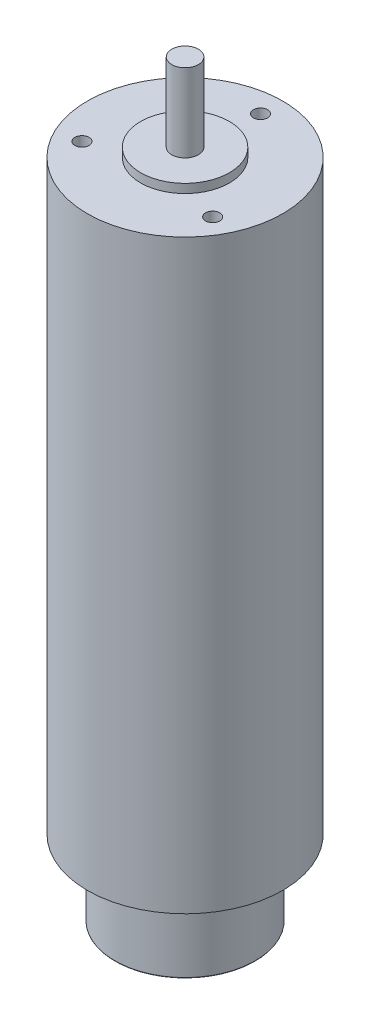
ISO-10303-21;
HEADER;
FILE_DESCRIPTION(('STEP AP214'),'2;1');
FILE_NAME('part.step','',(''),(''),'','','');
FILE_SCHEMA(('AUTOMOTIVE_DESIGN { 1 0 10303 214 1 1 1 1 }'));
ENDSEC;
DATA;
#1=APPLICATION_CONTEXT('core data for automotive mechanical design processes');
#2=APPLICATION_PROTOCOL_DEFINITION('international standard','automotive_design',2000,#1);
#3=PRODUCT_CONTEXT('',#1,'mechanical');
#4=PRODUCT('Part','Part','',(#3));
#5=PRODUCT_RELATED_PRODUCT_CATEGORY('part','',(#4));
#6=PRODUCT_DEFINITION_FORMATION('','',#4);
#7=PRODUCT_DEFINITION_CONTEXT('part definition',#1,'design');
#8=PRODUCT_DEFINITION('design','',#6,#7);
#9=PRODUCT_DEFINITION_SHAPE('','',#8);
#10=(LENGTH_UNIT() NAMED_UNIT(*) SI_UNIT(.MILLI.,.METRE.));
#11=(NAMED_UNIT(*) PLANE_ANGLE_UNIT() SI_UNIT($,.RADIAN.));
#12=(NAMED_UNIT(*) SI_UNIT($,.STERADIAN.) SOLID_ANGLE_UNIT());
#13=UNCERTAINTY_MEASURE_WITH_UNIT(LENGTH_MEASURE(1.E-05),#10,'distance_accuracy_value','');
#14=(GEOMETRIC_REPRESENTATION_CONTEXT(3) GLOBAL_UNCERTAINTY_ASSIGNED_CONTEXT((#13)) GLOBAL_UNIT_ASSIGNED_CONTEXT((#10,
#11,#12)) REPRESENTATION_CONTEXT('',''));
#15=CARTESIAN_POINT('',(0.,0.,0.));
#16=DIRECTION('',(0.,0.,1.));
#17=DIRECTION('',(1.,0.,0.));
#18=AXIS2_PLACEMENT_3D('',#15,#16,#17);
#19=CARTESIAN_POINT('',(0.,-8.5,0.));
#20=DIRECTION('',(0.,1.,0.));
#21=DIRECTION('',(0.,0.,1.));
#22=AXIS2_PLACEMENT_3D('',#19,#20,#21);
#23=CYLINDRICAL_SURFACE('',#22,7.9);
#24=CARTESIAN_POINT('',(0.,-8.4,0.));
#25=DIRECTION('',(0.,-1.,0.));
#26=DIRECTION('',(0.,0.,-1.));
#27=AXIS2_PLACEMENT_3D('',#24,#25,#26);
#28=CIRCLE('',#27,7.9);
#29=CARTESIAN_POINT('',(0.,-8.4,-7.9));
#30=VERTEX_POINT('',#29);
#31=EDGE_CURVE('E11',#30,#30,#28,.F.);
#32=ORIENTED_EDGE('',*,*,#31,.T.);
#33=EDGE_LOOP('',(#32));
#34=FACE_BOUND('',#33,.T.);
#35=CARTESIAN_POINT('',(0.,0.,0.));
#36=DIRECTION('',(0.,-1.,0.));
#37=DIRECTION('',(0.,0.,-1.));
#38=AXIS2_PLACEMENT_3D('',#35,#36,#37);
#39=CIRCLE('',#38,7.9);
#40=CARTESIAN_POINT('',(0.,0.,-7.9));
#41=VERTEX_POINT('',#40);
#42=EDGE_CURVE('E57',#41,#41,#39,.T.);
#43=ORIENTED_EDGE('',*,*,#42,.T.);
#44=EDGE_LOOP('',(#43));
#45=FACE_BOUND('',#44,.T.);
#46=ADVANCED_FACE('F46',(#34,#45),#23,.T.);
#47=CARTESIAN_POINT('',(0.,-8.5,0.));
#48=DIRECTION('',(0.,-1.,0.));
#49=DIRECTION('',(0.,0.,-1.));
#50=AXIS2_PLACEMENT_3D('',#47,#48,#49);
#51=PLANE('',#50);
#52=CARTESIAN_POINT('',(0.,-8.5,0.));
#53=DIRECTION('',(0.,-1.,0.));
#54=DIRECTION('',(0.,0.,-1.));
#55=AXIS2_PLACEMENT_3D('',#52,#53,#54);
#56=CIRCLE('',#55,7.8);
#57=CARTESIAN_POINT('',(0.,-8.5,-7.8));
#58=VERTEX_POINT('',#57);
#59=EDGE_CURVE('E53',#58,#58,#56,.T.);
#60=ORIENTED_EDGE('',*,*,#59,.T.);
#61=EDGE_LOOP('',(#60));
#62=FACE_BOUND('',#61,.T.);
#63=ADVANCED_FACE('F67',(#62),#51,.T.);
#64=CARTESIAN_POINT('',(0.,0.,0.));
#65=DIRECTION('',(0.,-1.,0.));
#66=DIRECTION('',(0.,0.,-1.));
#67=AXIS2_PLACEMENT_3D('',#64,#65,#66);
#68=PLANE('',#67);
#69=ORIENTED_EDGE('',*,*,#42,.F.);
#70=EDGE_LOOP('',(#69));
#71=FACE_BOUND('',#70,.T.);
#72=ADVANCED_FACE('F65',(#71),#68,.F.);
#73=CARTESIAN_POINT('',(0.,-8.4,0.));
#74=DIRECTION('',(0.,-1.,0.));
#75=DIRECTION('',(0.,0.,-1.));
#76=AXIS2_PLACEMENT_3D('',#73,#74,#75);
#77=TOROIDAL_SURFACE('',#76,7.8,0.1);
#78=ORIENTED_EDGE('',*,*,#31,.F.);
#79=EDGE_LOOP('',(#78));
#80=FACE_BOUND('',#79,.T.);
#81=ORIENTED_EDGE('',*,*,#59,.F.);
#82=EDGE_LOOP('',(#81));
#83=FACE_BOUND('',#82,.T.);
#84=ADVANCED_FACE('F48',(#80,#83),#77,.T.);
#85=CLOSED_SHELL('',(#46,#63,#72,#84));
#86=MANIFOLD_SOLID_BREP('B2',#85);
#87=CARTESIAN_POINT('',(0.,75.8,0.));
#88=DIRECTION('',(0.,-1.,0.));
#89=DIRECTION('',(0.,0.,-1.));
#90=AXIS2_PLACEMENT_3D('',#87,#88,#89);
#91=CYLINDRICAL_SURFACE('',#90,1.5);
#92=CARTESIAN_POINT('',(0.,75.8,0.));
#93=DIRECTION('',(0.,1.,0.));
#94=DIRECTION('',(0.,0.,1.));
#95=AXIS2_PLACEMENT_3D('',#92,#93,#94);
#96=CIRCLE('',#95,1.5);
#97=CARTESIAN_POINT('',(0.,75.8,1.5));
#98=VERTEX_POINT('',#97);
#99=EDGE_CURVE('E45',#98,#98,#96,.T.);
#100=ORIENTED_EDGE('',*,*,#99,.F.);
#101=EDGE_LOOP('',(#100));
#102=FACE_BOUND('',#101,.T.);
#103=CARTESIAN_POINT('',(0.,67.,0.));
#104=DIRECTION('',(0.,1.,0.));
#105=DIRECTION('',(0.,0.,1.));
#106=AXIS2_PLACEMENT_3D('',#103,#104,#105);
#107=CIRCLE('',#106,1.5);
#108=CARTESIAN_POINT('',(0.,67.,1.5));
#109=VERTEX_POINT('',#108);
#110=EDGE_CURVE('E113',#109,#109,#107,.T.);
#111=ORIENTED_EDGE('',*,*,#110,.T.);
#112=EDGE_LOOP('',(#111));
#113=FACE_BOUND('',#112,.T.);
#114=ADVANCED_FACE('F110',(#102,#113),#91,.T.);
#115=CARTESIAN_POINT('',(0.,75.8,0.));
#116=DIRECTION('',(0.,1.,0.));
#117=DIRECTION('',(0.,0.,1.));
#118=AXIS2_PLACEMENT_3D('',#115,#116,#117);
#119=PLANE('',#118);
#120=ORIENTED_EDGE('',*,*,#99,.T.);
#121=EDGE_LOOP('',(#120));
#122=FACE_BOUND('',#121,.T.);
#123=ADVANCED_FACE('F125',(#122),#119,.T.);
#124=CARTESIAN_POINT('',(0.,67.,0.));
#125=DIRECTION('',(0.,1.,0.));
#126=DIRECTION('',(0.,0.,1.));
#127=AXIS2_PLACEMENT_3D('',#124,#125,#126);
#128=PLANE('',#127);
#129=ORIENTED_EDGE('',*,*,#110,.F.);
#130=EDGE_LOOP('',(#129));
#131=FACE_BOUND('',#130,.T.);
#132=ADVANCED_FACE('F123',(#131),#128,.F.);
#133=CLOSED_SHELL('',(#114,#123,#132));
#134=MANIFOLD_SOLID_BREP('B6',#133);
#135=CARTESIAN_POINT('',(0.,67.,0.));
#136=DIRECTION('',(0.,-1.,0.));
#137=DIRECTION('',(0.,0.,-1.));
#138=AXIS2_PLACEMENT_3D('',#135,#136,#137);
#139=CYLINDRICAL_SURFACE('',#138,5.);
#140=CARTESIAN_POINT('',(0.,67.,0.));
#141=DIRECTION('',(0.,1.,0.));
#142=DIRECTION('',(0.,0.,1.));
#143=AXIS2_PLACEMENT_3D('',#140,#141,#142);
#144=CIRCLE('',#143,5.);
#145=CARTESIAN_POINT('',(0.,67.,5.));
#146=VERTEX_POINT('',#145);
#147=EDGE_CURVE('E109',#146,#146,#144,.T.);
#148=ORIENTED_EDGE('',*,*,#147,.F.);
#149=EDGE_LOOP('',(#148));
#150=FACE_BOUND('',#149,.T.);
#151=CARTESIAN_POINT('',(0.,66.,0.));
#152=DIRECTION('',(0.,1.,0.));
#153=DIRECTION('',(0.,0.,1.));
#154=AXIS2_PLACEMENT_3D('',#151,#152,#153);
#155=CIRCLE('',#154,5.);
#156=CARTESIAN_POINT('',(0.,66.,5.));
#157=VERTEX_POINT('',#156);
#158=EDGE_CURVE('E163',#157,#157,#155,.T.);
#159=ORIENTED_EDGE('',*,*,#158,.T.);
#160=EDGE_LOOP('',(#159));
#161=FACE_BOUND('',#160,.T.);
#162=ADVANCED_FACE('F160',(#150,#161),#139,.T.);
#163=CARTESIAN_POINT('',(0.,67.,0.));
#164=DIRECTION('',(0.,1.,0.));
#165=DIRECTION('',(0.,0.,1.));
#166=AXIS2_PLACEMENT_3D('',#163,#164,#165);
#167=PLANE('',#166);
#168=ORIENTED_EDGE('',*,*,#147,.T.);
#169=EDGE_LOOP('',(#168));
#170=FACE_BOUND('',#169,.T.);
#171=ADVANCED_FACE('F175',(#170),#167,.T.);
#172=CARTESIAN_POINT('',(0.,66.,0.));
#173=DIRECTION('',(0.,1.,0.));
#174=DIRECTION('',(0.,0.,1.));
#175=AXIS2_PLACEMENT_3D('',#172,#173,#174);
#176=PLANE('',#175);
#177=ORIENTED_EDGE('',*,*,#158,.F.);
#178=EDGE_LOOP('',(#177));
#179=FACE_BOUND('',#178,.T.);
#180=ADVANCED_FACE('F173',(#179),#176,.F.);
#181=CLOSED_SHELL('',(#162,#171,#180));
#182=MANIFOLD_SOLID_BREP('B40',#181);
#183=CARTESIAN_POINT('',(0.,66.,0.));
#184=DIRECTION('',(0.,-1.,0.));
#185=DIRECTION('',(0.,0.,-1.));
#186=AXIS2_PLACEMENT_3D('',#183,#184,#185);
#187=CYLINDRICAL_SURFACE('',#186,11.);
#188=CARTESIAN_POINT('',(0.,66.,0.));
#189=DIRECTION('',(0.,1.,0.));
#190=DIRECTION('',(0.,0.,1.));
#191=AXIS2_PLACEMENT_3D('',#188,#189,#190);
#192=CIRCLE('',#191,11.);
#193=CARTESIAN_POINT('',(0.,66.,11.));
#194=VERTEX_POINT('',#193);
#195=EDGE_CURVE('E158',#194,#194,#192,.T.);
#196=ORIENTED_EDGE('',*,*,#195,.F.);
#197=EDGE_LOOP('',(#196));
#198=FACE_BOUND('',#197,.T.);
#199=CARTESIAN_POINT('',(0.,0.,0.));
#200=DIRECTION('',(0.,1.,0.));
#201=DIRECTION('',(0.,0.,1.));
#202=AXIS2_PLACEMENT_3D('',#199,#200,#201);
#203=CIRCLE('',#202,11.);
#204=CARTESIAN_POINT('',(0.,0.,11.));
#205=VERTEX_POINT('',#204);
#206=EDGE_CURVE('E204',#205,#205,#203,.T.);
#207=ORIENTED_EDGE('',*,*,#206,.T.);
#208=EDGE_LOOP('',(#207));
#209=FACE_BOUND('',#208,.T.);
#210=ADVANCED_FACE('F201',(#198,#209),#187,.T.);
#211=CARTESIAN_POINT('',(0.,66.,0.));
#212=DIRECTION('',(0.,1.,0.));
#213=DIRECTION('',(0.,0.,1.));
#214=AXIS2_PLACEMENT_3D('',#211,#212,#213);
#215=PLANE('',#214);
#216=CARTESIAN_POINT('',(7.36121593216777,66.,4.24999999999993));
#217=DIRECTION('',(0.,1.,0.));
#218=DIRECTION('',(0.,0.,1.));
#219=AXIS2_PLACEMENT_3D('',#216,#217,#218);
#220=CIRCLE('',#219,0.799999999999999);
#221=CARTESIAN_POINT('',(7.36121593216777,66.,5.04999999999993));
#222=VERTEX_POINT('',#221);
#223=EDGE_CURVE('E229',#222,#222,#220,.T.);
#224=ORIENTED_EDGE('',*,*,#223,.F.);
#225=EDGE_LOOP('',(#224));
#226=FACE_BOUND('',#225,.T.);
#227=CARTESIAN_POINT('',(-7.36121593216771,66.,4.25000000000003));
#228=DIRECTION('',(0.,1.,0.));
#229=DIRECTION('',(0.,0.,1.));
#230=AXIS2_PLACEMENT_3D('',#227,#228,#229);
#231=CIRCLE('',#230,0.799999999999999);
#232=CARTESIAN_POINT('',(-7.36121593216771,66.,5.05000000000003));
#233=VERTEX_POINT('',#232);
#234=EDGE_CURVE('E228',#233,#233,#231,.T.);
#235=ORIENTED_EDGE('',*,*,#234,.F.);
#236=EDGE_LOOP('',(#235));
#237=FACE_BOUND('',#236,.T.);
#238=CARTESIAN_POINT('',(0.,66.,-8.5));
#239=DIRECTION('',(0.,1.,0.));
#240=DIRECTION('',(0.,0.,1.));
#241=AXIS2_PLACEMENT_3D('',#238,#239,#240);
#242=CIRCLE('',#241,0.799999999999999);
#243=CARTESIAN_POINT('',(0.,66.,-7.7));
#244=VERTEX_POINT('',#243);
#245=EDGE_CURVE('E239',#244,#244,#242,.T.);
#246=ORIENTED_EDGE('',*,*,#245,.F.);
#247=EDGE_LOOP('',(#246));
#248=FACE_BOUND('',#247,.T.);
#249=ORIENTED_EDGE('',*,*,#195,.T.);
#250=EDGE_LOOP('',(#249));
#251=FACE_BOUND('',#250,.T.);
#252=ADVANCED_FACE('F253',(#226,#237,#248,#251),#215,.T.);
#253=CARTESIAN_POINT('',(0.,0.,0.));
#254=DIRECTION('',(0.,1.,0.));
#255=DIRECTION('',(0.,0.,1.));
#256=AXIS2_PLACEMENT_3D('',#253,#254,#255);
#257=PLANE('',#256);
#258=ORIENTED_EDGE('',*,*,#206,.F.);
#259=EDGE_LOOP('',(#258));
#260=FACE_BOUND('',#259,.T.);
#261=ADVANCED_FACE('F250',(#260),#257,.F.);
#262=CARTESIAN_POINT('',(0.,61.,-8.5));
#263=DIRECTION('',(0.,1.,0.));
#264=DIRECTION('',(0.,0.,1.));
#265=AXIS2_PLACEMENT_3D('',#262,#263,#264);
#266=CONICAL_SURFACE('',#265,0.799999999999999,1.02974425867665);
#267=CARTESIAN_POINT('',(0.,60.519311504778,-8.5));
#268=VERTEX_POINT('',#267);
#269=VERTEX_LOOP('',#268);
#270=FACE_BOUND('',#269,.T.);
#271=CARTESIAN_POINT('',(0.,61.,-8.5));
#272=DIRECTION('',(0.,1.,0.));
#273=DIRECTION('',(0.,0.,1.));
#274=AXIS2_PLACEMENT_3D('',#271,#272,#273);
#275=CIRCLE('',#274,0.799999999999999);
#276=CARTESIAN_POINT('',(0.,61.,-7.7));
#277=VERTEX_POINT('',#276);
#278=EDGE_CURVE('E242',#277,#277,#275,.T.);
#279=ORIENTED_EDGE('',*,*,#278,.T.);
#280=EDGE_LOOP('',(#279));
#281=FACE_BOUND('',#280,.T.);
#282=ADVANCED_FACE('F252',(#270,#281),#266,.F.);
#283=CARTESIAN_POINT('',(0.,66.,-8.5));
#284=DIRECTION('',(0.,1.,0.));
#285=DIRECTION('',(0.,0.,1.));
#286=AXIS2_PLACEMENT_3D('',#283,#284,#285);
#287=CYLINDRICAL_SURFACE('',#286,0.799999999999999);
#288=ORIENTED_EDGE('',*,*,#278,.F.);
#289=EDGE_LOOP('',(#288));
#290=FACE_BOUND('',#289,.T.);
#291=ORIENTED_EDGE('',*,*,#245,.T.);
#292=EDGE_LOOP('',(#291));
#293=FACE_BOUND('',#292,.T.);
#294=ADVANCED_FACE('F258',(#290,#293),#287,.F.);
#295=CARTESIAN_POINT('',(-7.36121593216771,61.,4.25000000000003));
#296=DIRECTION('',(0.,1.,0.));
#297=DIRECTION('',(0.,0.,1.));
#298=AXIS2_PLACEMENT_3D('',#295,#296,#297);
#299=CONICAL_SURFACE('',#298,0.799999999999999,1.02974425867665);
#300=CARTESIAN_POINT('',(-7.36121593216771,60.519311504778,4.25000000000003));
#301=VERTEX_POINT('',#300);
#302=VERTEX_LOOP('',#301);
#303=FACE_BOUND('',#302,.T.);
#304=CARTESIAN_POINT('',(-7.36121593216771,61.,4.25000000000003));
#305=DIRECTION('',(0.,1.,0.));
#306=DIRECTION('',(0.,0.,1.));
#307=AXIS2_PLACEMENT_3D('',#304,#305,#306);
#308=CIRCLE('',#307,0.799999999999999);
#309=CARTESIAN_POINT('',(-7.36121593216771,61.,5.05000000000003));
#310=VERTEX_POINT('',#309);
#311=EDGE_CURVE('E232',#310,#310,#308,.T.);
#312=ORIENTED_EDGE('',*,*,#311,.T.);
#313=EDGE_LOOP('',(#312));
#314=FACE_BOUND('',#313,.T.);
#315=ADVANCED_FACE('F283',(#303,#314),#299,.F.);
#316=CARTESIAN_POINT('',(-7.36121593216771,66.,4.25000000000003));
#317=DIRECTION('',(0.,1.,0.));
#318=DIRECTION('',(0.,0.,1.));
#319=AXIS2_PLACEMENT_3D('',#316,#317,#318);
#320=CYLINDRICAL_SURFACE('',#319,0.799999999999999);
#321=ORIENTED_EDGE('',*,*,#311,.F.);
#322=EDGE_LOOP('',(#321));
#323=FACE_BOUND('',#322,.T.);
#324=ORIENTED_EDGE('',*,*,#234,.T.);
#325=EDGE_LOOP('',(#324));
#326=FACE_BOUND('',#325,.T.);
#327=ADVANCED_FACE('F222',(#323,#326),#320,.F.);
#328=CARTESIAN_POINT('',(7.36121593216777,61.,4.24999999999993));
#329=DIRECTION('',(0.,1.,0.));
#330=DIRECTION('',(0.,0.,1.));
#331=AXIS2_PLACEMENT_3D('',#328,#329,#330);
#332=CONICAL_SURFACE('',#331,0.799999999999999,1.02974425867665);
#333=CARTESIAN_POINT('',(7.36121593216777,60.519311504778,4.24999999999993));
#334=VERTEX_POINT('',#333);
#335=VERTEX_LOOP('',#334);
#336=FACE_BOUND('',#335,.T.);
#337=CARTESIAN_POINT('',(7.36121593216777,61.,4.24999999999993));
#338=DIRECTION('',(0.,1.,0.));
#339=DIRECTION('',(0.,0.,1.));
#340=AXIS2_PLACEMENT_3D('',#337,#338,#339);
#341=CIRCLE('',#340,0.799999999999999);
#342=CARTESIAN_POINT('',(7.36121593216777,61.,5.04999999999993));
#343=VERTEX_POINT('',#342);
#344=EDGE_CURVE('E226',#343,#343,#341,.T.);
#345=ORIENTED_EDGE('',*,*,#344,.T.);
#346=EDGE_LOOP('',(#345));
#347=FACE_BOUND('',#346,.T.);
#348=ADVANCED_FACE('F218',(#336,#347),#332,.F.);
#349=CARTESIAN_POINT('',(7.36121593216777,66.,4.24999999999993));
#350=DIRECTION('',(0.,1.,0.));
#351=DIRECTION('',(0.,0.,1.));
#352=AXIS2_PLACEMENT_3D('',#349,#350,#351);
#353=CYLINDRICAL_SURFACE('',#352,0.799999999999999);
#354=ORIENTED_EDGE('',*,*,#344,.F.);
#355=EDGE_LOOP('',(#354));
#356=FACE_BOUND('',#355,.T.);
#357=ORIENTED_EDGE('',*,*,#223,.T.);
#358=EDGE_LOOP('',(#357));
#359=FACE_BOUND('',#358,.T.);
#360=ADVANCED_FACE('F221',(#356,#359),#353,.F.);
#361=CLOSED_SHELL('',(#210,#252,#261,#282,#294,#315,#327,#348,#360));
#362=MANIFOLD_SOLID_BREP('B104',#361);
#363=ADVANCED_BREP_SHAPE_REPRESENTATION('',(#18,#86,#134,#182,#362),#14);
#364=SHAPE_DEFINITION_REPRESENTATION(#9,#363);
ENDSEC;
END-ISO-10303-21;
